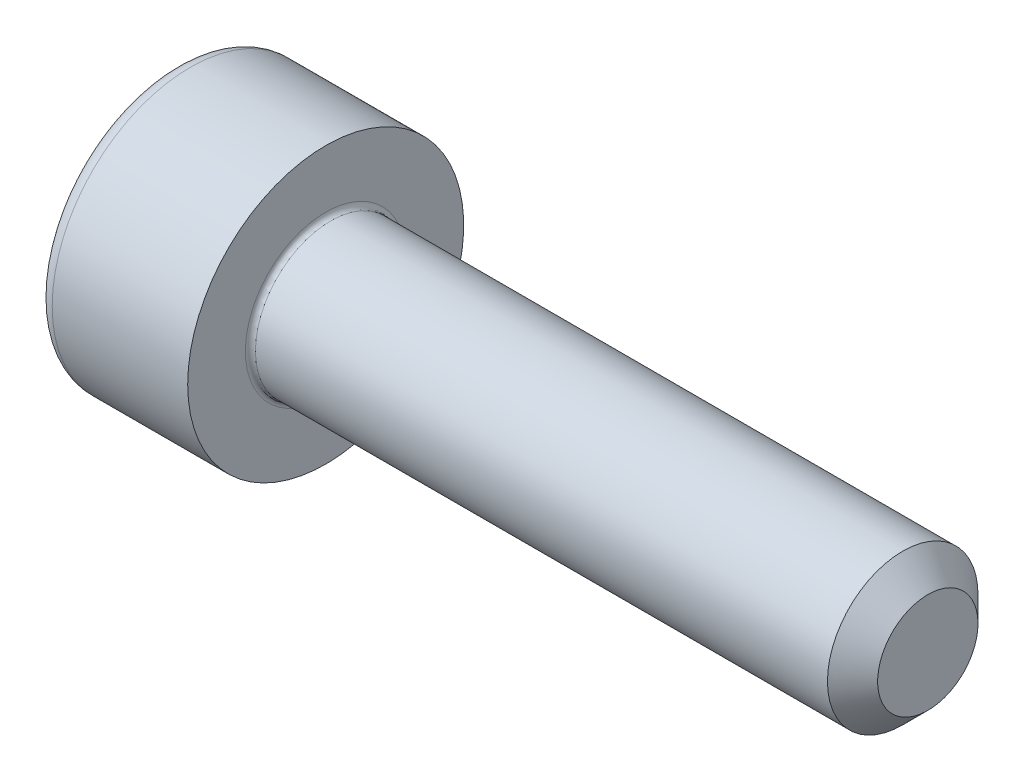
ISO-10303-21;
HEADER;
FILE_DESCRIPTION(('STEP AP214'),'2;1');
FILE_NAME('part.step','',(''),(''),'','','');
FILE_SCHEMA(('AUTOMOTIVE_DESIGN { 1 0 10303 214 1 1 1 1 }'));
ENDSEC;
DATA;
#1=APPLICATION_CONTEXT('core data for automotive mechanical design processes');
#2=APPLICATION_PROTOCOL_DEFINITION('international standard','automotive_design',2000,#1);
#3=PRODUCT_CONTEXT('',#1,'mechanical');
#4=PRODUCT('Part','Part','',(#3));
#5=PRODUCT_RELATED_PRODUCT_CATEGORY('part','',(#4));
#6=PRODUCT_DEFINITION_FORMATION('','',#4);
#7=PRODUCT_DEFINITION_CONTEXT('part definition',#1,'design');
#8=PRODUCT_DEFINITION('design','',#6,#7);
#9=PRODUCT_DEFINITION_SHAPE('','',#8);
#10=(LENGTH_UNIT() NAMED_UNIT(*) SI_UNIT(.MILLI.,.METRE.));
#11=(NAMED_UNIT(*) PLANE_ANGLE_UNIT() SI_UNIT($,.RADIAN.));
#12=(NAMED_UNIT(*) SI_UNIT($,.STERADIAN.) SOLID_ANGLE_UNIT());
#13=UNCERTAINTY_MEASURE_WITH_UNIT(LENGTH_MEASURE(1.E-05),#10,'distance_accuracy_value','');
#14=(GEOMETRIC_REPRESENTATION_CONTEXT(3) GLOBAL_UNCERTAINTY_ASSIGNED_CONTEXT((#13)) GLOBAL_UNIT_ASSIGNED_CONTEXT((#10,
#11,#12)) REPRESENTATION_CONTEXT('',''));
#15=CARTESIAN_POINT('',(0.,0.,0.));
#16=DIRECTION('',(0.,0.,1.));
#17=DIRECTION('',(1.,0.,0.));
#18=AXIS2_PLACEMENT_3D('',#15,#16,#17);
#19=CARTESIAN_POINT('',(0.1,0.,0.));
#20=DIRECTION('',(1.,0.,0.));
#21=DIRECTION('',(0.,-1.,0.));
#22=AXIS2_PLACEMENT_3D('',#19,#20,#21);
#23=TOROIDAL_SURFACE('',#22,1.6,0.1);
#24=CARTESIAN_POINT('',(0.,0.,0.));
#25=DIRECTION('',(1.,0.,0.));
#26=DIRECTION('',(0.,-1.,0.));
#27=AXIS2_PLACEMENT_3D('',#24,#25,#26);
#28=CIRCLE('',#27,1.6);
#29=CARTESIAN_POINT('',(0.,-1.6,0.));
#30=VERTEX_POINT('',#29);
#31=EDGE_CURVE('E210',#30,#30,#28,.T.);
#32=ORIENTED_EDGE('',*,*,#31,.T.);
#33=EDGE_LOOP('',(#32));
#34=FACE_BOUND('',#33,.T.);
#35=CARTESIAN_POINT('',(0.1,0.,0.));
#36=DIRECTION('',(-1.,0.,0.));
#37=DIRECTION('',(0.,0.,1.));
#38=AXIS2_PLACEMENT_3D('',#35,#36,#37);
#39=CIRCLE('',#38,1.5);
#40=CARTESIAN_POINT('',(0.1,0.,1.5));
#41=VERTEX_POINT('',#40);
#42=EDGE_CURVE('E211',#41,#41,#39,.T.);
#43=ORIENTED_EDGE('',*,*,#42,.T.);
#44=EDGE_LOOP('',(#43));
#45=FACE_BOUND('',#44,.T.);
#46=ADVANCED_FACE('F60',(#34,#45),#23,.F.);
#47=CARTESIAN_POINT('',(-2.7,0.,0.));
#48=DIRECTION('',(1.,0.,0.));
#49=DIRECTION('',(0.,0.,1.));
#50=AXIS2_PLACEMENT_3D('',#47,#48,#49);
#51=TOROIDAL_SURFACE('',#50,2.45,0.3);
#52=CARTESIAN_POINT('',(-3.,0.,0.));
#53=DIRECTION('',(1.,0.,0.));
#54=DIRECTION('',(0.,0.,1.));
#55=AXIS2_PLACEMENT_3D('',#52,#53,#54);
#56=CIRCLE('',#55,2.45);
#57=CARTESIAN_POINT('',(-3.,0.,2.45));
#58=VERTEX_POINT('',#57);
#59=EDGE_CURVE('E191',#58,#58,#56,.T.);
#60=ORIENTED_EDGE('',*,*,#59,.T.);
#61=EDGE_LOOP('',(#60));
#62=FACE_BOUND('',#61,.T.);
#63=CARTESIAN_POINT('',(-2.7,0.,0.));
#64=DIRECTION('',(1.,0.,0.));
#65=DIRECTION('',(0.,0.,1.));
#66=AXIS2_PLACEMENT_3D('',#63,#64,#65);
#67=CIRCLE('',#66,2.75);
#68=CARTESIAN_POINT('',(-2.7,0.,2.75));
#69=VERTEX_POINT('',#68);
#70=EDGE_CURVE('E201',#69,#69,#67,.T.);
#71=ORIENTED_EDGE('',*,*,#70,.F.);
#72=EDGE_LOOP('',(#71));
#73=FACE_BOUND('',#72,.T.);
#74=ADVANCED_FACE('F230',(#62,#73),#51,.T.);
#75=CARTESIAN_POINT('',(0.,0.,0.));
#76=DIRECTION('',(1.,0.,0.));
#77=DIRECTION('',(0.,0.,1.));
#78=AXIS2_PLACEMENT_3D('',#75,#76,#77);
#79=PLANE('',#78);
#80=ORIENTED_EDGE('',*,*,#31,.F.);
#81=EDGE_LOOP('',(#80));
#82=FACE_BOUND('',#81,.T.);
#83=CARTESIAN_POINT('',(0.,0.,0.));
#84=DIRECTION('',(1.,0.,0.));
#85=DIRECTION('',(0.,0.,1.));
#86=AXIS2_PLACEMENT_3D('',#83,#84,#85);
#87=CIRCLE('',#86,2.75);
#88=CARTESIAN_POINT('',(0.,0.,2.75));
#89=VERTEX_POINT('',#88);
#90=EDGE_CURVE('E197',#89,#89,#87,.T.);
#91=ORIENTED_EDGE('',*,*,#90,.T.);
#92=EDGE_LOOP('',(#91));
#93=FACE_BOUND('',#92,.T.);
#94=ADVANCED_FACE('F237',(#82,#93),#79,.T.);
#95=CARTESIAN_POINT('',(-3.,0.,0.));
#96=DIRECTION('',(1.,0.,0.));
#97=DIRECTION('',(0.,0.,1.));
#98=AXIS2_PLACEMENT_3D('',#95,#96,#97);
#99=CYLINDRICAL_SURFACE('',#98,2.75);
#100=ORIENTED_EDGE('',*,*,#70,.T.);
#101=EDGE_LOOP('',(#100));
#102=FACE_BOUND('',#101,.T.);
#103=ORIENTED_EDGE('',*,*,#90,.F.);
#104=EDGE_LOOP('',(#103));
#105=FACE_BOUND('',#104,.T.);
#106=ADVANCED_FACE('F265',(#102,#105),#99,.T.);
#107=CARTESIAN_POINT('',(0.133333333289239,-1.25,0.721687836487034));
#108=DIRECTION('',(0.,-0.5,0.866025403784439));
#109=DIRECTION('',(0.,0.866025403784439,0.5));
#110=AXIS2_PLACEMENT_3D('',#107,#108,#109);
#111=PLANE('',#110);
#112=CARTESIAN_POINT('',(-1.69999999999987,-1.25,0.721687836487035));
#113=CARTESIAN_POINT('',(-1.69738401948294,-1.24215203932499,0.726218858695339));
#114=CARTESIAN_POINT('',(-1.6922165499147,-1.22642783397098,0.735297232889276));
#115=CARTESIAN_POINT('',(-1.6846713619674,-1.20276898058198,0.748956678262127));
#116=CARTESIAN_POINT('',(-1.67733392896537,-1.17901516334059,0.762670951040728));
#117=CARTESIAN_POINT('',(-1.67021338001789,-1.15516514334506,0.776440766505325));
#118=CARTESIAN_POINT('',(-1.66253768859292,-1.12850348333736,0.791833883087814));
#119=CARTESIAN_POINT('',(-1.65367463731152,-1.09628003852828,0.810438097622551));
#120=CARTESIAN_POINT('',(-1.64360384312695,-1.05722065582976,0.832989042737921));
#121=CARTESIAN_POINT('',(-1.63372595374146,-1.01552255276089,0.857063453769432));
#122=CARTESIAN_POINT('',(-1.62415304160412,-0.971037529922755,0.882746893679936));
#123=CARTESIAN_POINT('',(-1.61437860911247,-0.920014398444216,0.912205112373968));
#124=CARTESIAN_POINT('',(-1.60493575093948,-0.861148465760758,0.94619137445486));
#125=CARTESIAN_POINT('',(-1.59763295469434,-0.802112128018892,0.980276019942097));
#126=CARTESIAN_POINT('',(-1.59322233484196,-0.753207018638113,1.00851139800784));
#127=CARTESIAN_POINT('',(-1.59067705349734,-0.71409478336521,1.03109285757126));
#128=CARTESIAN_POINT('',(-1.58915372065229,-0.679736799705594,1.05092944868595));
#129=CARTESIAN_POINT('',(-1.58834848889278,-0.644843445143961,1.07107513633504));
#130=CARTESIAN_POINT('',(-1.58829905866402,-0.609392767050834,1.09154259487506));
#131=CARTESIAN_POINT('',(-1.58903450088332,-0.573624128278051,1.11219362809907));
#132=CARTESIAN_POINT('',(-1.59056900030582,-0.537634757313027,1.13297210111369));
#133=CARTESIAN_POINT('',(-1.59289700232276,-0.501605681203261,1.15377349790432));
#134=CARTESIAN_POINT('',(-1.59601207891327,-0.465548040949067,1.17459138621142));
#135=CARTESIAN_POINT('',(-1.5999027213972,-0.429490466158829,1.19540923672289));
#136=CARTESIAN_POINT('',(-1.60455788341784,-0.393424641510312,1.21623185029226));
#137=CARTESIAN_POINT('',(-1.60995884670772,-0.357380152398952,1.2370421457835));
#138=CARTESIAN_POINT('',(-1.61608835380497,-0.321356169143508,1.25784060221332));
#139=CARTESIAN_POINT('',(-1.62292110031353,-0.285384285521163,1.27860897890593));
#140=CARTESIAN_POINT('',(-1.63043333920983,-0.249471247576269,1.29934338103084));
#141=CARTESIAN_POINT('',(-1.63859848012798,-0.213629543182003,1.32003659871108));
#142=CARTESIAN_POINT('',(-1.64739518608139,-0.17784538919857,1.34069658964614));
#143=CARTESIAN_POINT('',(-1.65679600883554,-0.142129567892932,1.36131712869128));
#144=CARTESIAN_POINT('',(-1.66677755965338,-0.10647502690417,1.38190228752897));
#145=CARTESIAN_POINT('',(-1.67731135856734,-0.0708929602258874,1.402445603304));
#146=CARTESIAN_POINT('',(-1.68837275186723,-0.0353810996675898,1.42294838555676));
#147=CARTESIAN_POINT('',(-1.69607201648135,-0.0117840267349489,1.43657216196651));
#148=CARTESIAN_POINT('',(-1.69999999999987,0.,1.44337567297407));
#149=B_SPLINE_CURVE_WITH_KNOTS('',3,(#112,#113,#114,#115,#116,#117,#118,#119,#120,#121,#122,
#123,#124,#125,#126,#127,#128,#129,#130,#131,#132,#133,#134,#135,#136,#137,#138,#139,#140,#141,
#142,#143,#144,#145,#146,#147,#148),.UNSPECIFIED.,.F.,.F.,(4,1,1,1,1,1,1,1,1,1,1,1,1,1,1,1,1,1,
1,1,1,1,1,1,1,1,1,1,1,1,1,1,1,1,4),(0.,0.0193286094422815,0.0386758778059963,0.0580433526518195,
0.0774601551828898,0.0969018530867074,0.122980681924948,0.155735511331439,0.191472868184122,
0.223581141428566,0.262696925229055,0.31374010739609,0.364073010828582,0.403001156408343,
0.429649119201364,0.456644552348079,0.48425991734535,0.51213956948865,0.54044675371789,
0.568839006632917,0.597298408954167,0.625777869427183,0.65433651245964,0.682914884875453,
0.711553298380966,0.740225079816359,0.768942792806602,0.797668936453434,0.826435603416019,
0.855234706304396,0.884091922636723,0.912980528265628,0.941935664746071,0.970940011129428,1.),.UNSPECIFIED.);
#150=CARTESIAN_POINT('',(-1.69999999999982,-1.25,0.721687836487035));
#151=VERTEX_POINT('',#150);
#152=CARTESIAN_POINT('',(-1.69999999999973,0.,1.44337567297407));
#153=VERTEX_POINT('',#152);
#154=EDGE_CURVE('E163',#151,#153,#149,.T.);
#155=ORIENTED_EDGE('',*,*,#154,.F.);
#156=DIRECTION('',(-1.,0.,0.));
#157=VECTOR('',#156,1.);
#158=CARTESIAN_POINT('',(-1.69999999999973,-1.25,0.721687836487034));
#159=LINE('',#158,#157);
#160=CARTESIAN_POINT('',(-3.,-1.25,0.721687836487033));
#161=VERTEX_POINT('',#160);
#162=EDGE_CURVE('E182',#151,#161,#159,.T.);
#163=ORIENTED_EDGE('',*,*,#162,.T.);
#164=DIRECTION('',(0.,0.866025403784439,0.5));
#165=VECTOR('',#164,1.);
#166=CARTESIAN_POINT('',(-3.,-1.25,0.721687836487034));
#167=LINE('',#166,#165);
#168=CARTESIAN_POINT('',(-3.,0.,1.44337567297407));
#169=VERTEX_POINT('',#168);
#170=EDGE_CURVE('E187',#161,#169,#167,.T.);
#171=ORIENTED_EDGE('',*,*,#170,.T.);
#172=DIRECTION('',(-1.,0.,0.));
#173=VECTOR('',#172,1.);
#174=CARTESIAN_POINT('',(-1.69999999999973,0.,1.44337567297407));
#175=LINE('',#174,#173);
#176=EDGE_CURVE('E126',#153,#169,#175,.T.);
#177=ORIENTED_EDGE('',*,*,#176,.F.);
#178=EDGE_LOOP('',(#155,#163,#171,#177));
#179=FACE_BOUND('',#178,.T.);
#180=ADVANCED_FACE('F258',(#179),#111,.F.);
#181=CARTESIAN_POINT('',(0.133333333289239,0.,1.44337567297407));
#182=DIRECTION('',(0.,0.5,0.866025403784439));
#183=DIRECTION('',(0.,0.866025403784439,-0.5));
#184=AXIS2_PLACEMENT_3D('',#181,#182,#183);
#185=PLANE('',#184);
#186=CARTESIAN_POINT('',(-1.69999999999987,0.,1.44337567297407));
#187=CARTESIAN_POINT('',(-1.69738401948294,0.00784796067500621,1.43884465076576));
#188=CARTESIAN_POINT('',(-1.6922165499147,0.0235721660290274,1.42976627657183));
#189=CARTESIAN_POINT('',(-1.6846713619674,0.0472310194180179,1.41610683119898));
#190=CARTESIAN_POINT('',(-1.67733392896537,0.0709848366594086,1.40239255842038));
#191=CARTESIAN_POINT('',(-1.67021338001789,0.0948348566549364,1.38862274295578));
#192=CARTESIAN_POINT('',(-1.66253768859292,0.121496516662632,1.3732296263733));
#193=CARTESIAN_POINT('',(-1.65367463731152,0.153719961471703,1.35462541183856));
#194=CARTESIAN_POINT('',(-1.64360384312696,0.192779344170216,1.3320744667232));
#195=CARTESIAN_POINT('',(-1.63372595374147,0.234477447239084,1.30800005569169));
#196=CARTESIAN_POINT('',(-1.62415304160413,0.278962470077212,1.28231661578119));
#197=CARTESIAN_POINT('',(-1.61437860911248,0.329985601555743,1.25285839708716));
#198=CARTESIAN_POINT('',(-1.60493575093949,0.38885153423919,1.21887213500627));
#199=CARTESIAN_POINT('',(-1.59763295469434,0.447887871981046,1.18478748951904));
#200=CARTESIAN_POINT('',(-1.59322233484197,0.496792981361817,1.15655211145331));
#201=CARTESIAN_POINT('',(-1.59067705349735,0.535905216634715,1.13397065188989));
#202=CARTESIAN_POINT('',(-1.58915372065229,0.570263200294327,1.1141340607752));
#203=CARTESIAN_POINT('',(-1.58834848889279,0.605156554855955,1.09398837312612));
#204=CARTESIAN_POINT('',(-1.58829905866402,0.640607232949079,1.0735209145861));
#205=CARTESIAN_POINT('',(-1.58903450088332,0.676375871721859,1.05286988136209));
#206=CARTESIAN_POINT('',(-1.59056900030581,0.712365242686879,1.03209140834747));
#207=CARTESIAN_POINT('',(-1.59289700232275,0.748394318796646,1.01129001155684));
#208=CARTESIAN_POINT('',(-1.59601207891326,0.784451959050839,0.990472123249737));
#209=CARTESIAN_POINT('',(-1.59990272139718,0.820509533841079,0.969654272738267));
#210=CARTESIAN_POINT('',(-1.60455788341783,0.856575358489599,0.948831659168899));
#211=CARTESIAN_POINT('',(-1.6099588467077,0.892619847600962,0.92802136367765));
#212=CARTESIAN_POINT('',(-1.61608835380496,0.928643830856412,0.907222907247834));
#213=CARTESIAN_POINT('',(-1.62292110031352,0.964615714478762,0.886454530555211));
#214=CARTESIAN_POINT('',(-1.63043333920981,1.00052875242366,0.865720128430306));
#215=CARTESIAN_POINT('',(-1.63859848012796,1.03637045681794,0.845026910750056));
#216=CARTESIAN_POINT('',(-1.64739518608137,1.07215461080138,0.824366919814993));
#217=CARTESIAN_POINT('',(-1.65679600883552,1.10787043210703,0.803746380769848));
#218=CARTESIAN_POINT('',(-1.66677755965337,1.1435249730958,0.783161221932148));
#219=CARTESIAN_POINT('',(-1.67731135856734,1.17910703977409,0.762617906157113));
#220=CARTESIAN_POINT('',(-1.68837275186723,1.2146189003324,0.742115123904349));
#221=CARTESIAN_POINT('',(-1.69607201648135,1.23821597326505,0.728491347494598));
#222=CARTESIAN_POINT('',(-1.69999999999986,1.25,0.721687836487037));
#223=B_SPLINE_CURVE_WITH_KNOTS('',3,(#186,#187,#188,#189,#190,#191,#192,#193,#194,#195,#196,
#197,#198,#199,#200,#201,#202,#203,#204,#205,#206,#207,#208,#209,#210,#211,#212,#213,#214,#215,
#216,#217,#218,#219,#220,#221,#222),.UNSPECIFIED.,.F.,.F.,(4,1,1,1,1,1,1,1,1,1,1,1,1,1,1,1,1,1,
1,1,1,1,1,1,1,1,1,1,1,1,1,1,1,1,4),(0.,0.0193286094422852,0.038675877805997,0.0580433526518165,
0.0774601551828836,0.096901853086698,0.122980681924932,0.155735511331419,0.191472868184097,
0.223581141428535,0.26269692522902,0.313740107396046,0.364073010828529,0.403001156408285,
0.429649119201302,0.456644552348014,0.484259917345281,0.512139569488578,0.540446753717816,
0.56883900663284,0.59729840895409,0.625777869427106,0.654336512459564,0.68291488487538,
0.711553298380895,0.740225079816292,0.768942792806539,0.797668936453377,0.82643560341597,
0.855234706304354,0.884091922636689,0.912980528265602,0.941935664746054,0.97094001112942,1.),.UNSPECIFIED.);
#224=CARTESIAN_POINT('',(-1.69999999999981,1.25,0.721687836487036));
#225=VERTEX_POINT('',#224);
#226=EDGE_CURVE('E161',#153,#225,#223,.T.);
#227=ORIENTED_EDGE('',*,*,#226,.F.);
#228=ORIENTED_EDGE('',*,*,#176,.T.);
#229=DIRECTION('',(0.,0.866025403784439,-0.5));
#230=VECTOR('',#229,1.);
#231=CARTESIAN_POINT('',(-3.,0.,1.44337567297407));
#232=LINE('',#231,#230);
#233=CARTESIAN_POINT('',(-3.,1.25,0.721687836487037));
#234=VERTEX_POINT('',#233);
#235=EDGE_CURVE('E132',#169,#234,#232,.T.);
#236=ORIENTED_EDGE('',*,*,#235,.T.);
#237=DIRECTION('',(-1.,0.,0.));
#238=VECTOR('',#237,1.);
#239=CARTESIAN_POINT('',(-1.69999999999973,1.25,0.721687836487036));
#240=LINE('',#239,#238);
#241=EDGE_CURVE('E118',#225,#234,#240,.T.);
#242=ORIENTED_EDGE('',*,*,#241,.F.);
#243=EDGE_LOOP('',(#227,#228,#236,#242));
#244=FACE_BOUND('',#243,.T.);
#245=ADVANCED_FACE('F135',(#244),#185,.F.);
#246=CARTESIAN_POINT('',(0.133333333289239,1.25,0.721687836487036));
#247=DIRECTION('',(0.,1.,0.));
#248=DIRECTION('',(0.,0.,-1.));
#249=AXIS2_PLACEMENT_3D('',#246,#247,#248);
#250=PLANE('',#249);
#251=CARTESIAN_POINT('',(-1.69999999999986,1.25,0.721687836487036));
#252=CARTESIAN_POINT('',(-1.69738401948294,1.25,0.712625792070429));
#253=CARTESIAN_POINT('',(-1.6922165499147,1.25,0.694469043682561));
#254=CARTESIAN_POINT('',(-1.6846713619674,1.25,0.667150152936864));
#255=CARTESIAN_POINT('',(-1.67733392896537,1.25,0.639721607379672));
#256=CARTESIAN_POINT('',(-1.67021338001789,1.25,0.612181976450485));
#257=CARTESIAN_POINT('',(-1.66253768859292,1.25,0.581395743285518));
#258=CARTESIAN_POINT('',(-1.65367463731153,1.25,0.544187314216054));
#259=CARTESIAN_POINT('',(-1.64360384312696,1.25,0.499085423985328));
#260=CARTESIAN_POINT('',(-1.63372595374147,1.25,0.450936601922322));
#261=CARTESIAN_POINT('',(-1.62415304160414,1.25,0.399569722101333));
#262=CARTESIAN_POINT('',(-1.61437860911249,1.25,0.340653284713289));
#263=CARTESIAN_POINT('',(-1.6049357509395,1.25,0.272680760551531));
#264=CARTESIAN_POINT('',(-1.59763295469435,1.25,0.204511469577086));
#265=CARTESIAN_POINT('',(-1.59322233484197,1.25,0.148040713445626));
#266=CARTESIAN_POINT('',(-1.59067705349735,1.25,0.102877794318804));
#267=CARTESIAN_POINT('',(-1.58915372065229,1.25,0.0632046120894322));
#268=CARTESIAN_POINT('',(-1.58834848889278,1.25,0.0229132367912671));
#269=CARTESIAN_POINT('',(-1.58829905866402,1.25,-0.0180216802887679));
#270=CARTESIAN_POINT('',(-1.58903450088331,1.25,-0.0593237467367864));
#271=CARTESIAN_POINT('',(-1.5905690003058,1.25,-0.100880692766023));
#272=CARTESIAN_POINT('',(-1.59289700232274,1.25,-0.142483486347277));
#273=CARTESIAN_POINT('',(-1.59601207891324,1.25,-0.18411926296148));
#274=CARTESIAN_POINT('',(-1.59990272139717,1.25,-0.225754963984424));
#275=CARTESIAN_POINT('',(-1.60455788341781,1.25,-0.267400191123166));
#276=CARTESIAN_POINT('',(-1.60995884670768,1.25,-0.309020782105669));
#277=CARTESIAN_POINT('',(-1.61608835380494,1.25,-0.350617694965311));
#278=CARTESIAN_POINT('',(-1.6229211003135,1.25,-0.392154448350565));
#279=CARTESIAN_POINT('',(-1.63043333920979,1.25,-0.433623252600389));
#280=CARTESIAN_POINT('',(-1.63859848012794,1.25,-0.475009687960901));
#281=CARTESIAN_POINT('',(-1.64739518608136,1.25,-0.516329669831042));
#282=CARTESIAN_POINT('',(-1.65679600883551,1.25,-0.557570747921346));
#283=CARTESIAN_POINT('',(-1.66677755965335,1.25,-0.598741065596762));
#284=CARTESIAN_POINT('',(-1.67731135856733,1.25,-0.63982769714685));
#285=CARTESIAN_POINT('',(-1.68837275186722,1.25,-0.680833261652393));
#286=CARTESIAN_POINT('',(-1.69607201648135,1.25,-0.708080814471907));
#287=CARTESIAN_POINT('',(-1.69999999999986,1.25,-0.721687836487034));
#288=B_SPLINE_CURVE_WITH_KNOTS('',3,(#251,#252,#253,#254,#255,#256,#257,#258,#259,#260,#261,
#262,#263,#264,#265,#266,#267,#268,#269,#270,#271,#272,#273,#274,#275,#276,#277,#278,#279,#280,
#281,#282,#283,#284,#285,#286,#287),.UNSPECIFIED.,.F.,.F.,(4,1,1,1,1,1,1,1,1,1,1,1,1,1,1,1,1,1,
1,1,1,1,1,1,1,1,1,1,1,1,1,1,1,1,4),(0.,0.0193286094422788,0.0386758778059875,0.0580433526518041,
0.0774601551828686,0.0969018530866802,0.122980681924911,0.155735511331393,0.191472868184064,
0.223581141428496,0.262696925228972,0.313740107395987,0.364073010828459,0.403001156408204,
0.429649119201216,0.456644552347923,0.484259917345186,0.51213956948848,0.540446753717715,
0.568839006632737,0.597298408953986,0.625777869427002,0.654336512459462,0.68291488487528,
0.7115532983808,0.740225079816202,0.768942792806457,0.797668936453302,0.826435603415904,
0.855234706304297,0.884091922636643,0.912980528265567,0.941935664746031,0.970940011129409,1.),.UNSPECIFIED.);
#289=CARTESIAN_POINT('',(-1.69999999999981,1.25,-0.721687836487034));
#290=VERTEX_POINT('',#289);
#291=EDGE_CURVE('E125',#225,#290,#288,.T.);
#292=ORIENTED_EDGE('',*,*,#291,.F.);
#293=ORIENTED_EDGE('',*,*,#241,.T.);
#294=DIRECTION('',(0.,0.,-1.));
#295=VECTOR('',#294,1.);
#296=CARTESIAN_POINT('',(-3.,1.25,0.721687836487036));
#297=LINE('',#296,#295);
#298=CARTESIAN_POINT('',(-3.,1.25,-0.721687836487035));
#299=VERTEX_POINT('',#298);
#300=EDGE_CURVE('E116',#234,#299,#297,.T.);
#301=ORIENTED_EDGE('',*,*,#300,.T.);
#302=DIRECTION('',(-1.,0.,0.));
#303=VECTOR('',#302,1.);
#304=CARTESIAN_POINT('',(-1.69999999999973,1.25,-0.721687836487034));
#305=LINE('',#304,#303);
#306=EDGE_CURVE('E129',#290,#299,#305,.T.);
#307=ORIENTED_EDGE('',*,*,#306,.F.);
#308=EDGE_LOOP('',(#292,#293,#301,#307));
#309=FACE_BOUND('',#308,.T.);
#310=ADVANCED_FACE('F117',(#309),#250,.F.);
#311=CARTESIAN_POINT('',(0.133333333289239,1.25,-0.721687836487034));
#312=DIRECTION('',(0.,0.5,-0.866025403784439));
#313=DIRECTION('',(0.,-0.866025403784439,-0.5));
#314=AXIS2_PLACEMENT_3D('',#311,#312,#313);
#315=PLANE('',#314);
#316=CARTESIAN_POINT('',(-1.69999999999986,1.25,-0.721687836487034));
#317=CARTESIAN_POINT('',(-1.69738401948294,1.24215203932499,-0.726218858695339));
#318=CARTESIAN_POINT('',(-1.6922165499147,1.22642783397097,-0.735297232889276));
#319=CARTESIAN_POINT('',(-1.6846713619674,1.20276898058198,-0.748956678262131));
#320=CARTESIAN_POINT('',(-1.67733392896536,1.17901516334058,-0.762670951040733));
#321=CARTESIAN_POINT('',(-1.67021338001788,1.15516514334504,-0.776440766505336));
#322=CARTESIAN_POINT('',(-1.66253768859291,1.12850348333733,-0.791833883087827));
#323=CARTESIAN_POINT('',(-1.65367463731151,1.09628003852824,-0.81043809762257));
#324=CARTESIAN_POINT('',(-1.64360384312694,1.05722065582971,-0.832989042737947));
#325=CARTESIAN_POINT('',(-1.63372595374144,1.01552255276083,-0.857063453769465));
#326=CARTESIAN_POINT('',(-1.62415304160411,0.971037529922679,-0.882746893679978));
#327=CARTESIAN_POINT('',(-1.61437860911245,0.920014398444122,-0.91220511237402));
#328=CARTESIAN_POINT('',(-1.60493575093946,0.861148465760644,-0.946191374454924));
#329=CARTESIAN_POINT('',(-1.59763295469432,0.802112128018757,-0.980276019942171));
#330=CARTESIAN_POINT('',(-1.59322233484195,0.753207018637962,-1.00851139800792));
#331=CARTESIAN_POINT('',(-1.59067705349733,0.714094783365046,-1.03109285757135));
#332=CARTESIAN_POINT('',(-1.58915372065228,0.67973679970542,-1.05092944868605));
#333=CARTESIAN_POINT('',(-1.58834848889278,0.644843445143779,-1.07107513633514));
#334=CARTESIAN_POINT('',(-1.58829905866403,0.609392767050644,-1.09154259487516));
#335=CARTESIAN_POINT('',(-1.58903450088333,0.573624128277854,-1.11219362809918));
#336=CARTESIAN_POINT('',(-1.59056900030583,0.537634757312828,-1.1329721011138));
#337=CARTESIAN_POINT('',(-1.59289700232277,0.501605681203059,-1.15377349790443));
#338=CARTESIAN_POINT('',(-1.59601207891328,0.465548040948867,-1.17459138621153));
#339=CARTESIAN_POINT('',(-1.59990272139722,0.429490466158631,-1.195409236723));
#340=CARTESIAN_POINT('',(-1.60455788341786,0.393424641510121,-1.21623185029236));
#341=CARTESIAN_POINT('',(-1.60995884670774,0.357380152398769,-1.23704214578361));
#342=CARTESIAN_POINT('',(-1.616088353805,0.321356169143335,-1.25784060221341));
#343=CARTESIAN_POINT('',(-1.62292110031356,0.285384285521004,-1.27860897890602));
#344=CARTESIAN_POINT('',(-1.63043333920986,0.249471247576124,-1.29934338103092));
#345=CARTESIAN_POINT('',(-1.63859848012801,0.213629543181873,-1.32003659871115));
#346=CARTESIAN_POINT('',(-1.64739518608141,0.177845389198457,-1.3406965896462));
#347=CARTESIAN_POINT('',(-1.65679600883556,0.142129567892837,-1.36131712869133));
#348=CARTESIAN_POINT('',(-1.66677755965339,0.106475026904096,-1.38190228752901));
#349=CARTESIAN_POINT('',(-1.67731135856736,0.0708929602258341,-1.40244560330403));
#350=CARTESIAN_POINT('',(-1.68837275186724,0.0353810996675606,-1.42294838555677));
#351=CARTESIAN_POINT('',(-1.69607201648136,0.0117840267349361,-1.43657216196651));
#352=CARTESIAN_POINT('',(-1.69999999999986,0.,-1.44337567297406));
#353=B_SPLINE_CURVE_WITH_KNOTS('',3,(#316,#317,#318,#319,#320,#321,#322,#323,#324,#325,#326,
#327,#328,#329,#330,#331,#332,#333,#334,#335,#336,#337,#338,#339,#340,#341,#342,#343,#344,#345,
#346,#347,#348,#349,#350,#351,#352),.UNSPECIFIED.,.F.,.F.,(4,1,1,1,1,1,1,1,1,1,1,1,1,1,1,1,1,1,
1,1,1,1,1,1,1,1,1,1,1,1,1,1,1,1,4),(0.,0.0193286094422844,0.038675877806003,0.0580433526518305,
0.0774601551829062,0.09690185308673,0.122980681924976,0.155735511331478,0.191472868184172,
0.223581141428625,0.262696925229127,0.31374010739618,0.364073010828688,0.403001156408462,
0.429649119201491,0.456644552348215,0.484259917345492,0.512139569488797,0.540446753718042,
0.568839006633072,0.597298408954323,0.625777869427339,0.654336512459793,0.682914884875602,
0.711553298381108,0.740225079816493,0.768942792806725,0.797668936453546,0.82643560341612,
0.855234706304484,0.884091922636796,0.912980528265685,0.941935664746111,0.97094001112945,1.),.UNSPECIFIED.);
#354=CARTESIAN_POINT('',(-1.69999999999973,0.,-1.44337567297406));
#355=VERTEX_POINT('',#354);
#356=EDGE_CURVE('E352',#290,#355,#353,.T.);
#357=ORIENTED_EDGE('',*,*,#356,.F.);
#358=ORIENTED_EDGE('',*,*,#306,.T.);
#359=DIRECTION('',(0.,-0.866025403784439,-0.5));
#360=VECTOR('',#359,1.);
#361=CARTESIAN_POINT('',(-3.,1.25,-0.721687836487034));
#362=LINE('',#361,#360);
#363=CARTESIAN_POINT('',(-3.,0.,-1.44337567297406));
#364=VERTEX_POINT('',#363);
#365=EDGE_CURVE('E148',#299,#364,#362,.T.);
#366=ORIENTED_EDGE('',*,*,#365,.T.);
#367=DIRECTION('',(-1.,0.,0.));
#368=VECTOR('',#367,1.);
#369=CARTESIAN_POINT('',(-1.69999999999973,0.,-1.44337567297406));
#370=LINE('',#369,#368);
#371=EDGE_CURVE('E159',#355,#364,#370,.T.);
#372=ORIENTED_EDGE('',*,*,#371,.F.);
#373=EDGE_LOOP('',(#357,#358,#366,#372));
#374=FACE_BOUND('',#373,.T.);
#375=ADVANCED_FACE('F250',(#374),#315,.F.);
#376=CARTESIAN_POINT('',(0.133333333289239,0.,-1.44337567297406));
#377=DIRECTION('',(0.,-0.5,-0.866025403784438));
#378=DIRECTION('',(0.,-0.866025403784438,0.5));
#379=AXIS2_PLACEMENT_3D('',#376,#377,#378);
#380=PLANE('',#379);
#381=CARTESIAN_POINT('',(-1.69999999999986,0.,-1.44337567297406));
#382=CARTESIAN_POINT('',(-1.69738401948294,-0.00784796067500364,-1.43884465076576));
#383=CARTESIAN_POINT('',(-1.6922165499147,-0.0235721660290173,-1.42976627657183));
#384=CARTESIAN_POINT('',(-1.6846713619674,-0.047231019418001,-1.41610683119898));
#385=CARTESIAN_POINT('',(-1.67733392896537,-0.0709848366593899,-1.40239255842038));
#386=CARTESIAN_POINT('',(-1.67021338001789,-0.0948348566549163,-1.38862274295579));
#387=CARTESIAN_POINT('',(-1.66253768859292,-0.121496516662611,-1.3732296263733));
#388=CARTESIAN_POINT('',(-1.65367463731153,-0.153719961471681,-1.35462541183857));
#389=CARTESIAN_POINT('',(-1.64360384312696,-0.192779344170191,-1.3320744667232));
#390=CARTESIAN_POINT('',(-1.63372595374147,-0.234477447239055,-1.3080000556917));
#391=CARTESIAN_POINT('',(-1.62415304160413,-0.27896247007718,-1.2823166157812));
#392=CARTESIAN_POINT('',(-1.61437860911248,-0.329985601555706,-1.25285839708718));
#393=CARTESIAN_POINT('',(-1.60493575093949,-0.388851534239146,-1.21887213500629));
#394=CARTESIAN_POINT('',(-1.59763295469434,-0.447887871980996,-1.18478748951907));
#395=CARTESIAN_POINT('',(-1.59322233484197,-0.496792981361762,-1.15655211145333));
#396=CARTESIAN_POINT('',(-1.59067705349735,-0.535905216634655,-1.13397065188992));
#397=CARTESIAN_POINT('',(-1.58915372065229,-0.570263200294263,-1.11413406077523));
#398=CARTESIAN_POINT('',(-1.58834848889278,-0.605156554855889,-1.09398837312615));
#399=CARTESIAN_POINT('',(-1.58829905866402,-0.640607232949011,-1.07352091458613));
#400=CARTESIAN_POINT('',(-1.58903450088332,-0.67637587172179,-1.05286988136212));
#401=CARTESIAN_POINT('',(-1.5905690003058,-0.712365242686809,-1.0320914083475));
#402=CARTESIAN_POINT('',(-1.59289700232274,-0.748394318796576,-1.01129001155687));
#403=CARTESIAN_POINT('',(-1.59601207891325,-0.784451959050769,-0.990472123249772));
#404=CARTESIAN_POINT('',(-1.59990272139717,-0.820509533841012,-0.9696542727383));
#405=CARTESIAN_POINT('',(-1.60455788341782,-0.856575358489533,-0.94883165916893));
#406=CARTESIAN_POINT('',(-1.60995884670769,-0.892619847600901,-0.92802136367768));
#407=CARTESIAN_POINT('',(-1.61608835380495,-0.928643830856355,-0.907222907247861));
#408=CARTESIAN_POINT('',(-1.62292110031351,-0.964615714478711,-0.886454530555236));
#409=CARTESIAN_POINT('',(-1.6304333392098,-1.00052875242362,-0.865720128430327));
#410=CARTESIAN_POINT('',(-1.63859848012795,-1.0363704568179,-0.845026910750073));
#411=CARTESIAN_POINT('',(-1.64739518608136,-1.07215461080135,-0.824366919815006));
#412=CARTESIAN_POINT('',(-1.65679600883552,-1.107870432107,-0.803746380769857));
#413=CARTESIAN_POINT('',(-1.66677755965336,-1.14352497309578,-0.783161221932152));
#414=CARTESIAN_POINT('',(-1.67731135856733,-1.17910703977408,-0.762617906157112));
#415=CARTESIAN_POINT('',(-1.68837275186723,-1.2146189003324,-0.742115123904345));
#416=CARTESIAN_POINT('',(-1.69607201648135,-1.23821597326505,-0.728491347494592));
#417=CARTESIAN_POINT('',(-1.69999999999986,-1.25,-0.72168783648703));
#418=B_SPLINE_CURVE_WITH_KNOTS('',3,(#381,#382,#383,#384,#385,#386,#387,#388,#389,#390,#391,
#392,#393,#394,#395,#396,#397,#398,#399,#400,#401,#402,#403,#404,#405,#406,#407,#408,#409,#410,
#411,#412,#413,#414,#415,#416,#417),.UNSPECIFIED.,.F.,.F.,(4,1,1,1,1,1,1,1,1,1,1,1,1,1,1,1,1,1,
1,1,1,1,1,1,1,1,1,1,1,1,1,1,1,1,4),(0.,0.019328609442274,0.0386758778059845,0.0580433526518032,
0.0774601551828703,0.0969018530866851,0.122980681924919,0.155735511331404,0.191472868184079,
0.223581141428515,0.262696925228994,0.313740107396015,0.364073010828492,0.403001156408242,
0.429649119201256,0.456644552347965,0.48425991734523,0.512139569488526,0.540446753717762,
0.568839006632785,0.597298408954035,0.625777869427051,0.65433651245951,0.682914884875327,
0.711553298380845,0.740225079816245,0.768942792806496,0.797668936453339,0.826435603415936,
0.855234706304325,0.884091922636666,0.912980528265586,0.941935664746044,0.970940011129416,1.),.UNSPECIFIED.);
#419=CARTESIAN_POINT('',(-1.69999999999981,-1.25,-0.721687836487031));
#420=VERTEX_POINT('',#419);
#421=EDGE_CURVE('E345',#355,#420,#418,.T.);
#422=ORIENTED_EDGE('',*,*,#421,.F.);
#423=ORIENTED_EDGE('',*,*,#371,.T.);
#424=DIRECTION('',(0.,-0.866025403784438,0.5));
#425=VECTOR('',#424,1.);
#426=CARTESIAN_POINT('',(-3.,0.,-1.44337567297406));
#427=LINE('',#426,#425);
#428=CARTESIAN_POINT('',(-3.,-1.25,-0.721687836487028));
#429=VERTEX_POINT('',#428);
#430=EDGE_CURVE('E151',#364,#429,#427,.T.);
#431=ORIENTED_EDGE('',*,*,#430,.T.);
#432=DIRECTION('',(-1.,0.,0.));
#433=VECTOR('',#432,1.);
#434=CARTESIAN_POINT('',(-1.69999999999973,-1.25,-0.721687836487031));
#435=LINE('',#434,#433);
#436=EDGE_CURVE('E189',#420,#429,#435,.T.);
#437=ORIENTED_EDGE('',*,*,#436,.F.);
#438=EDGE_LOOP('',(#422,#423,#431,#437));
#439=FACE_BOUND('',#438,.T.);
#440=ADVANCED_FACE('F241',(#439),#380,.F.);
#441=CARTESIAN_POINT('',(0.133333333289239,-1.25,-0.721687836487031));
#442=DIRECTION('',(0.,-1.,0.));
#443=DIRECTION('',(0.,0.,1.));
#444=AXIS2_PLACEMENT_3D('',#441,#442,#443);
#445=PLANE('',#444);
#446=CARTESIAN_POINT('',(-1.69999999999986,-1.25,-0.72168783648703));
#447=CARTESIAN_POINT('',(-1.68952620537607,-1.25000000098073,-0.685402704109452));
#448=CARTESIAN_POINT('',(-1.66882662532746,-1.25000000047391,-0.609426524114409));
#449=CARTESIAN_POINT('',(-1.64216462328561,-1.24999999653124,-0.495567471339054));
#450=CARTESIAN_POINT('',(-1.62091524111501,-1.25000000079919,-0.384284635832132));
#451=CARTESIAN_POINT('',(-1.60602622647925,-1.24999999982635,-0.283416065071795));
#452=CARTESIAN_POINT('',(-1.59595460164164,-1.25000000004584,-0.18912397710867));
#453=CARTESIAN_POINT('',(-1.58979451832237,-1.2499999999877,-0.096121255574874));
#454=CARTESIAN_POINT('',(-1.58834722259695,-1.24999999999578,-0.0325311952212167));
#455=CARTESIAN_POINT('',(-1.58835450315953,-1.24999999999987,0.));
#456=B_SPLINE_CURVE_WITH_KNOTS('',3,(#446,#447,#448,#449,#450,#451,#452,#453,#454,#455),
.UNSPECIFIED.,.F.,.F.,(4,1,1,1,1,1,1,4),(0.,0.15464663082682,0.32233761678327,0.478698544215034,
0.61840543615109,0.739680361911978,0.866888771115841,1.),.UNSPECIFIED.);
#457=CARTESIAN_POINT('',(-1.58835450315953,-1.24999999999987,0.));
#458=VERTEX_POINT('',#457);
#459=EDGE_CURVE('E354',#420,#458,#456,.T.);
#460=ORIENTED_EDGE('',*,*,#459,.F.);
#461=ORIENTED_EDGE('',*,*,#436,.T.);
#462=DIRECTION('',(0.,0.,1.));
#463=VECTOR('',#462,1.);
#464=CARTESIAN_POINT('',(-3.,-1.25,-0.721687836487031));
#465=LINE('',#464,#463);
#466=EDGE_CURVE('E194',#429,#161,#465,.T.);
#467=ORIENTED_EDGE('',*,*,#466,.T.);
#468=ORIENTED_EDGE('',*,*,#162,.F.);
#469=CARTESIAN_POINT('',(-1.58835450315953,-1.24999999999987,0.));
#470=CARTESIAN_POINT('',(-1.58834655337041,-1.24999999999995,0.0332113064453385));
#471=CARTESIAN_POINT('',(-1.58986890770249,-1.25000000000002,0.0986999582225013));
#472=CARTESIAN_POINT('',(-1.5964399058259,-1.25,0.195338682543529));
#473=CARTESIAN_POINT('',(-1.60788370358651,-1.25,0.298925607584719));
#474=CARTESIAN_POINT('',(-1.62512567463451,-1.25,0.409278174253511));
#475=CARTESIAN_POINT('',(-1.64887876229215,-1.25,0.526138809119023));
#476=CARTESIAN_POINT('',(-1.67430736459291,-1.25,0.629971803135887));
#477=CARTESIAN_POINT('',(-1.69219697844036,-1.25,0.694656343300826));
#478=CARTESIAN_POINT('',(-1.69999999999987,-1.25,0.721687836487035));
#479=B_SPLINE_CURVE_WITH_KNOTS('',3,(#469,#470,#471,#472,#473,#474,#475,#476,#477,#478),
.UNSPECIFIED.,.F.,.F.,(4,1,1,1,1,1,1,4),(0.,0.135881251771568,0.268088734046202,
0.396575364343073,0.562487499680676,0.725224599421058,0.884758394713962,1.),.UNSPECIFIED.);
#480=EDGE_CURVE('E137',#458,#151,#479,.T.);
#481=ORIENTED_EDGE('',*,*,#480,.F.);
#482=EDGE_LOOP('',(#460,#461,#467,#468,#481));
#483=FACE_BOUND('',#482,.T.);
#484=ADVANCED_FACE('F244',(#483),#445,.F.);
#485=CARTESIAN_POINT('',(-1.28333333335538,0.,0.));
#486=DIRECTION('',(-1.,0.,0.));
#487=DIRECTION('',(0.,1.,0.));
#488=AXIS2_PLACEMENT_3D('',#485,#486,#487);
#489=CONICAL_SURFACE('',#488,0.721687836487032,1.04719755121951);
#490=CARTESIAN_POINT('',(-0.866666666710761,0.,0.));
#491=VERTEX_POINT('',#490);
#492=VERTEX_LOOP('',#491);
#493=FACE_BOUND('',#492,.T.);
#494=ORIENTED_EDGE('',*,*,#480,.T.);
#495=ORIENTED_EDGE('',*,*,#154,.T.);
#496=ORIENTED_EDGE('',*,*,#226,.T.);
#497=ORIENTED_EDGE('',*,*,#291,.T.);
#498=ORIENTED_EDGE('',*,*,#356,.T.);
#499=ORIENTED_EDGE('',*,*,#421,.T.);
#500=ORIENTED_EDGE('',*,*,#459,.T.);
#501=EDGE_LOOP('',(#494,#495,#496,#497,#498,#499,#500));
#502=FACE_BOUND('',#501,.T.);
#503=ADVANCED_FACE('F245',(#493,#502),#489,.F.);
#504=CARTESIAN_POINT('',(-3.,0.,0.));
#505=DIRECTION('',(-1.,0.,0.));
#506=DIRECTION('',(0.,0.,1.));
#507=AXIS2_PLACEMENT_3D('',#504,#505,#506);
#508=PLANE('',#507);
#509=ORIENTED_EDGE('',*,*,#170,.F.);
#510=ORIENTED_EDGE('',*,*,#466,.F.);
#511=ORIENTED_EDGE('',*,*,#430,.F.);
#512=ORIENTED_EDGE('',*,*,#365,.F.);
#513=ORIENTED_EDGE('',*,*,#300,.F.);
#514=ORIENTED_EDGE('',*,*,#235,.F.);
#515=EDGE_LOOP('',(#509,#510,#511,#512,#513,#514));
#516=FACE_BOUND('',#515,.T.);
#517=ORIENTED_EDGE('',*,*,#59,.F.);
#518=EDGE_LOOP('',(#517));
#519=FACE_BOUND('',#518,.T.);
#520=ADVANCED_FACE('F142',(#516,#519),#508,.T.);
#521=CARTESIAN_POINT('',(12.,0.,0.));
#522=DIRECTION('',(-1.,0.,0.));
#523=DIRECTION('',(0.,0.,1.));
#524=AXIS2_PLACEMENT_3D('',#521,#522,#523);
#525=CYLINDRICAL_SURFACE('',#524,1.5);
#526=CARTESIAN_POINT('',(11.5,0.,0.));
#527=DIRECTION('',(1.,0.,0.));
#528=DIRECTION('',(0.,0.,-1.));
#529=AXIS2_PLACEMENT_3D('',#526,#527,#528);
#530=CIRCLE('',#529,1.5);
#531=CARTESIAN_POINT('',(11.5,0.,-1.5));
#532=VERTEX_POINT('',#531);
#533=EDGE_CURVE('E11',#532,#532,#530,.F.);
#534=ORIENTED_EDGE('',*,*,#533,.T.);
#535=EDGE_LOOP('',(#534));
#536=FACE_BOUND('',#535,.T.);
#537=ORIENTED_EDGE('',*,*,#42,.F.);
#538=EDGE_LOOP('',(#537));
#539=FACE_BOUND('',#538,.T.);
#540=ADVANCED_FACE('F223',(#536,#539),#525,.T.);
#541=CARTESIAN_POINT('',(12.,0.,0.));
#542=DIRECTION('',(1.,0.,0.));
#543=DIRECTION('',(0.,0.,-1.));
#544=AXIS2_PLACEMENT_3D('',#541,#542,#543);
#545=PLANE('',#544);
#546=CARTESIAN_POINT('',(12.,0.,0.));
#547=DIRECTION('',(1.,0.,0.));
#548=DIRECTION('',(0.,0.,-1.));
#549=AXIS2_PLACEMENT_3D('',#546,#547,#548);
#550=CIRCLE('',#549,0.999999999999997);
#551=CARTESIAN_POINT('',(12.,0.,-0.999999999999997));
#552=VERTEX_POINT('',#551);
#553=EDGE_CURVE('E70',#552,#552,#550,.T.);
#554=ORIENTED_EDGE('',*,*,#553,.T.);
#555=EDGE_LOOP('',(#554));
#556=FACE_BOUND('',#555,.T.);
#557=ADVANCED_FACE('F217',(#556),#545,.T.);
#558=CARTESIAN_POINT('',(12.,0.,0.));
#559=DIRECTION('',(-1.,0.,0.));
#560=DIRECTION('',(0.,0.,1.));
#561=AXIS2_PLACEMENT_3D('',#558,#559,#560);
#562=CONICAL_SURFACE('',#561,0.999999999999997,0.785398163397446);
#563=ORIENTED_EDGE('',*,*,#533,.F.);
#564=EDGE_LOOP('',(#563));
#565=FACE_BOUND('',#564,.T.);
#566=ORIENTED_EDGE('',*,*,#553,.F.);
#567=EDGE_LOOP('',(#566));
#568=FACE_BOUND('',#567,.T.);
#569=ADVANCED_FACE('F58',(#565,#568),#562,.T.);
#570=CLOSED_SHELL('',(#46,#74,#94,#106,#180,#245,#310,#375,#440,#484,#503,#520,#540,#557,#569));
#571=MANIFOLD_SOLID_BREP('B2',#570);
#572=ADVANCED_BREP_SHAPE_REPRESENTATION('',(#18,#571),#14);
#573=SHAPE_DEFINITION_REPRESENTATION(#9,#572);
ENDSEC;
END-ISO-10303-21;
